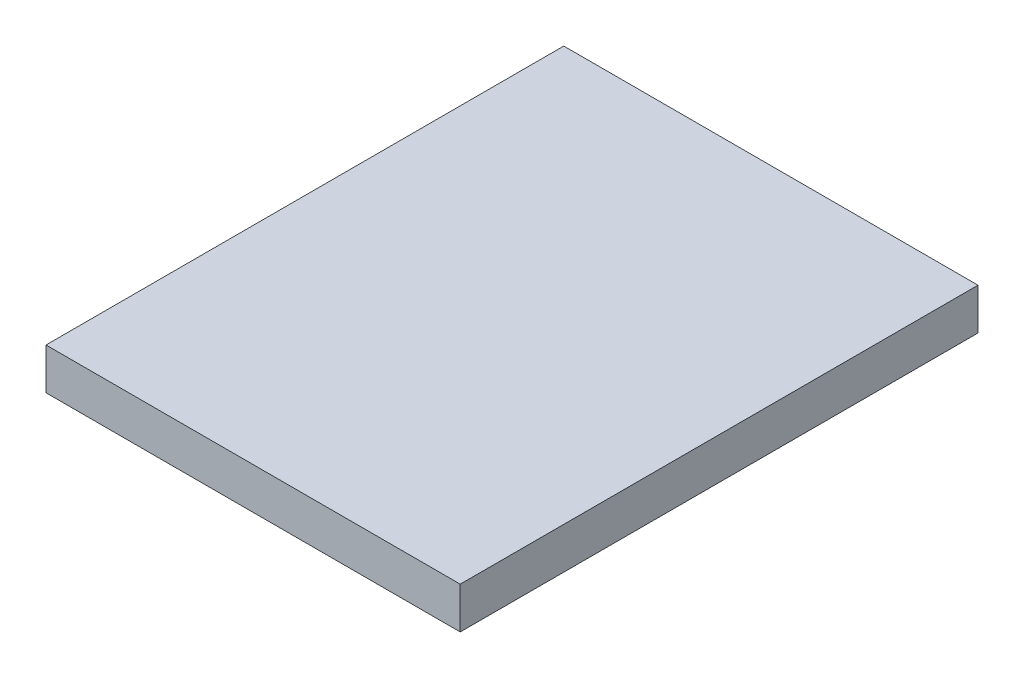
ISO-10303-21;
HEADER;
FILE_DESCRIPTION(('STEP AP214'),'2;1');
FILE_NAME('part.step','',(''),(''),'','','');
FILE_SCHEMA(('AUTOMOTIVE_DESIGN { 1 0 10303 214 1 1 1 1 }'));
ENDSEC;
DATA;
#1=APPLICATION_CONTEXT('core data for automotive mechanical design processes');
#2=APPLICATION_PROTOCOL_DEFINITION('international standard','automotive_design',2000,#1);
#3=PRODUCT_CONTEXT('',#1,'mechanical');
#4=PRODUCT('Part','Part','',(#3));
#5=PRODUCT_RELATED_PRODUCT_CATEGORY('part','',(#4));
#6=PRODUCT_DEFINITION_FORMATION('','',#4);
#7=PRODUCT_DEFINITION_CONTEXT('part definition',#1,'design');
#8=PRODUCT_DEFINITION('design','',#6,#7);
#9=PRODUCT_DEFINITION_SHAPE('','',#8);
#10=(LENGTH_UNIT() NAMED_UNIT(*) SI_UNIT(.MILLI.,.METRE.));
#11=(NAMED_UNIT(*) PLANE_ANGLE_UNIT() SI_UNIT($,.RADIAN.));
#12=(NAMED_UNIT(*) SI_UNIT($,.STERADIAN.) SOLID_ANGLE_UNIT());
#13=UNCERTAINTY_MEASURE_WITH_UNIT(LENGTH_MEASURE(1.E-05),#10,'distance_accuracy_value','');
#14=(GEOMETRIC_REPRESENTATION_CONTEXT(3) GLOBAL_UNCERTAINTY_ASSIGNED_CONTEXT((#13)) GLOBAL_UNIT_ASSIGNED_CONTEXT((#10,
#11,#12)) REPRESENTATION_CONTEXT('',''));
#15=CARTESIAN_POINT('',(0.,0.,0.));
#16=DIRECTION('',(0.,0.,1.));
#17=DIRECTION('',(1.,0.,0.));
#18=AXIS2_PLACEMENT_3D('',#15,#16,#17);
#19=CARTESIAN_POINT('',(-61.3756613756614,10.,-51.5873015873016));
#20=DIRECTION('',(1.,0.,0.));
#21=DIRECTION('',(0.,0.,-1.));
#22=AXIS2_PLACEMENT_3D('',#19,#20,#21);
#23=PLANE('',#22);
#24=DIRECTION('',(0.,0.,1.));
#25=VECTOR('',#24,1.);
#26=CARTESIAN_POINT('',(-61.3756613756614,0.,-51.5873015873016));
#27=LINE('',#26,#25);
#28=CARTESIAN_POINT('',(-61.3756613756614,0.,-51.5873015873016));
#29=VERTEX_POINT('',#28);
#30=CARTESIAN_POINT('',(-61.3756613756614,0.,73.4126984126984));
#31=VERTEX_POINT('',#30);
#32=EDGE_CURVE('E113',#29,#31,#27,.T.);
#33=ORIENTED_EDGE('',*,*,#32,.T.);
#34=DIRECTION('',(0.,-1.,0.));
#35=VECTOR('',#34,1.);
#36=CARTESIAN_POINT('',(-61.3756613756614,10.,73.4126984126984));
#37=LINE('',#36,#35);
#38=CARTESIAN_POINT('',(-61.3756613756614,10.,73.4126984126984));
#39=VERTEX_POINT('',#38);
#40=EDGE_CURVE('E11',#39,#31,#37,.T.);
#41=ORIENTED_EDGE('',*,*,#40,.F.);
#42=DIRECTION('',(0.,0.,1.));
#43=VECTOR('',#42,1.);
#44=CARTESIAN_POINT('',(-61.3756613756614,10.,-51.5873015873016));
#45=LINE('',#44,#43);
#46=CARTESIAN_POINT('',(-61.3756613756614,10.,-51.5873015873016));
#47=VERTEX_POINT('',#46);
#48=EDGE_CURVE('E97',#47,#39,#45,.T.);
#49=ORIENTED_EDGE('',*,*,#48,.F.);
#50=DIRECTION('',(0.,-1.,0.));
#51=VECTOR('',#50,1.);
#52=CARTESIAN_POINT('',(-61.3756613756614,10.,-51.5873015873016));
#53=LINE('',#52,#51);
#54=EDGE_CURVE('E109',#47,#29,#53,.T.);
#55=ORIENTED_EDGE('',*,*,#54,.T.);
#56=EDGE_LOOP('',(#33,#41,#49,#55));
#57=FACE_BOUND('',#56,.T.);
#58=ADVANCED_FACE('F45',(#57),#23,.F.);
#59=CARTESIAN_POINT('',(-61.3756613756614,10.,73.4126984126984));
#60=DIRECTION('',(0.,0.,-1.));
#61=DIRECTION('',(-1.,0.,0.));
#62=AXIS2_PLACEMENT_3D('',#59,#60,#61);
#63=PLANE('',#62);
#64=DIRECTION('',(1.,0.,0.));
#65=VECTOR('',#64,1.);
#66=CARTESIAN_POINT('',(-61.3756613756614,0.,73.4126984126984));
#67=LINE('',#66,#65);
#68=CARTESIAN_POINT('',(38.6243386243386,0.,73.4126984126984));
#69=VERTEX_POINT('',#68);
#70=EDGE_CURVE('E102',#31,#69,#67,.T.);
#71=ORIENTED_EDGE('',*,*,#70,.T.);
#72=DIRECTION('',(0.,-1.,0.));
#73=VECTOR('',#72,1.);
#74=CARTESIAN_POINT('',(38.6243386243386,10.,73.4126984126984));
#75=LINE('',#74,#73);
#76=CARTESIAN_POINT('',(38.6243386243386,10.,73.4126984126984));
#77=VERTEX_POINT('',#76);
#78=EDGE_CURVE('E54',#77,#69,#75,.T.);
#79=ORIENTED_EDGE('',*,*,#78,.F.);
#80=DIRECTION('',(1.,0.,0.));
#81=VECTOR('',#80,1.);
#82=CARTESIAN_POINT('',(-61.3756613756614,10.,73.4126984126984));
#83=LINE('',#82,#81);
#84=EDGE_CURVE('E92',#39,#77,#83,.T.);
#85=ORIENTED_EDGE('',*,*,#84,.F.);
#86=ORIENTED_EDGE('',*,*,#40,.T.);
#87=EDGE_LOOP('',(#71,#79,#85,#86));
#88=FACE_BOUND('',#87,.T.);
#89=ADVANCED_FACE('F101',(#88),#63,.F.);
#90=CARTESIAN_POINT('',(38.6243386243386,10.,-51.5873015873016));
#91=DIRECTION('',(-1.,0.,0.));
#92=DIRECTION('',(0.,0.,1.));
#93=AXIS2_PLACEMENT_3D('',#90,#91,#92);
#94=PLANE('',#93);
#95=DIRECTION('',(0.,0.,-1.));
#96=VECTOR('',#95,1.);
#97=CARTESIAN_POINT('',(38.6243386243386,0.,-51.5873015873016));
#98=LINE('',#97,#96);
#99=CARTESIAN_POINT('',(38.6243386243386,0.,-51.5873015873016));
#100=VERTEX_POINT('',#99);
#101=EDGE_CURVE('E79',#69,#100,#98,.T.);
#102=ORIENTED_EDGE('',*,*,#101,.T.);
#103=DIRECTION('',(0.,-1.,0.));
#104=VECTOR('',#103,1.);
#105=CARTESIAN_POINT('',(38.6243386243386,10.,-51.5873015873016));
#106=LINE('',#105,#104);
#107=CARTESIAN_POINT('',(38.6243386243386,10.,-51.5873015873016));
#108=VERTEX_POINT('',#107);
#109=EDGE_CURVE('E104',#108,#100,#106,.T.);
#110=ORIENTED_EDGE('',*,*,#109,.F.);
#111=DIRECTION('',(0.,0.,-1.));
#112=VECTOR('',#111,1.);
#113=CARTESIAN_POINT('',(38.6243386243386,10.,-51.5873015873016));
#114=LINE('',#113,#112);
#115=EDGE_CURVE('E95',#77,#108,#114,.T.);
#116=ORIENTED_EDGE('',*,*,#115,.F.);
#117=ORIENTED_EDGE('',*,*,#78,.T.);
#118=EDGE_LOOP('',(#102,#110,#116,#117));
#119=FACE_BOUND('',#118,.T.);
#120=ADVANCED_FACE('F105',(#119),#94,.F.);
#121=CARTESIAN_POINT('',(-61.3756613756614,10.,-51.5873015873016));
#122=DIRECTION('',(0.,0.,1.));
#123=DIRECTION('',(1.,0.,0.));
#124=AXIS2_PLACEMENT_3D('',#121,#122,#123);
#125=PLANE('',#124);
#126=DIRECTION('',(-1.,0.,0.));
#127=VECTOR('',#126,1.);
#128=CARTESIAN_POINT('',(-61.3756613756614,0.,-51.5873015873016));
#129=LINE('',#128,#127);
#130=EDGE_CURVE('E85',#100,#29,#129,.T.);
#131=ORIENTED_EDGE('',*,*,#130,.T.);
#132=ORIENTED_EDGE('',*,*,#54,.F.);
#133=DIRECTION('',(-1.,0.,0.));
#134=VECTOR('',#133,1.);
#135=CARTESIAN_POINT('',(-61.3756613756614,10.,-51.5873015873016));
#136=LINE('',#135,#134);
#137=EDGE_CURVE('E62',#108,#47,#136,.T.);
#138=ORIENTED_EDGE('',*,*,#137,.F.);
#139=ORIENTED_EDGE('',*,*,#109,.T.);
#140=EDGE_LOOP('',(#131,#132,#138,#139));
#141=FACE_BOUND('',#140,.T.);
#142=ADVANCED_FACE('F126',(#141),#125,.F.);
#143=CARTESIAN_POINT('',(0.,10.,0.));
#144=DIRECTION('',(0.,1.,0.));
#145=DIRECTION('',(0.,0.,1.));
#146=AXIS2_PLACEMENT_3D('',#143,#144,#145);
#147=PLANE('',#146);
#148=ORIENTED_EDGE('',*,*,#48,.T.);
#149=ORIENTED_EDGE('',*,*,#84,.T.);
#150=ORIENTED_EDGE('',*,*,#115,.T.);
#151=ORIENTED_EDGE('',*,*,#137,.T.);
#152=EDGE_LOOP('',(#148,#149,#150,#151));
#153=FACE_BOUND('',#152,.T.);
#154=ADVANCED_FACE('F93',(#153),#147,.T.);
#155=CARTESIAN_POINT('',(0.,0.,0.));
#156=DIRECTION('',(0.,1.,0.));
#157=DIRECTION('',(0.,0.,1.));
#158=AXIS2_PLACEMENT_3D('',#155,#156,#157);
#159=PLANE('',#158);
#160=ORIENTED_EDGE('',*,*,#32,.F.);
#161=ORIENTED_EDGE('',*,*,#130,.F.);
#162=ORIENTED_EDGE('',*,*,#101,.F.);
#163=ORIENTED_EDGE('',*,*,#70,.F.);
#164=EDGE_LOOP('',(#160,#161,#162,#163));
#165=FACE_BOUND('',#164,.T.);
#166=ADVANCED_FACE('F129',(#165),#159,.F.);
#167=CLOSED_SHELL('',(#58,#89,#120,#142,#154,#166));
#168=MANIFOLD_SOLID_BREP('B2',#167);
#169=ADVANCED_BREP_SHAPE_REPRESENTATION('',(#18,#168),#14);
#170=SHAPE_DEFINITION_REPRESENTATION(#9,#169);
ENDSEC;
END-ISO-10303-21;
